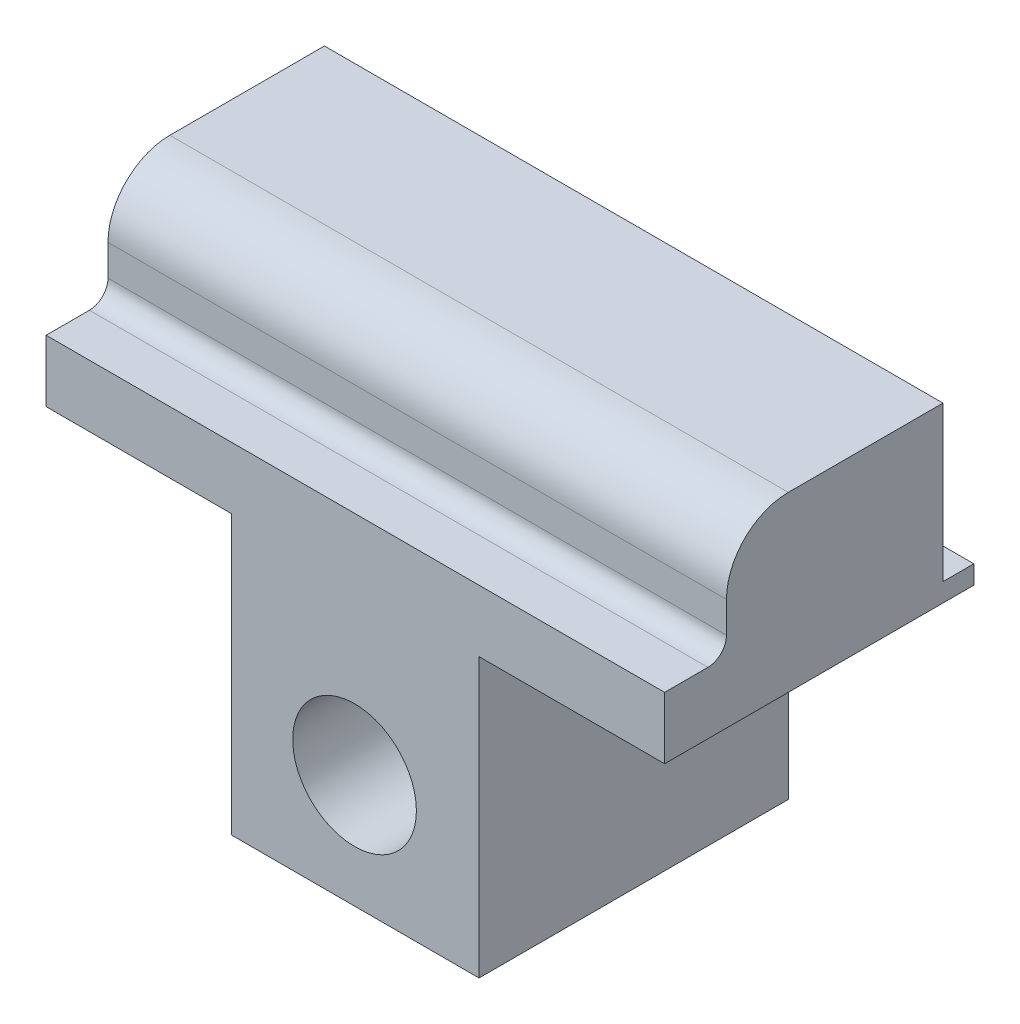
ISO-10303-21;
HEADER;
FILE_DESCRIPTION(('STEP AP214'),'2;1');
FILE_NAME('part.step','',(''),(''),'','','');
FILE_SCHEMA(('AUTOMOTIVE_DESIGN { 1 0 10303 214 1 1 1 1 }'));
ENDSEC;
DATA;
#1=APPLICATION_CONTEXT('core data for automotive mechanical design processes');
#2=APPLICATION_PROTOCOL_DEFINITION('international standard','automotive_design',2000,#1);
#3=PRODUCT_CONTEXT('',#1,'mechanical');
#4=PRODUCT('Part','Part','',(#3));
#5=PRODUCT_RELATED_PRODUCT_CATEGORY('part','',(#4));
#6=PRODUCT_DEFINITION_FORMATION('','',#4);
#7=PRODUCT_DEFINITION_CONTEXT('part definition',#1,'design');
#8=PRODUCT_DEFINITION('design','',#6,#7);
#9=PRODUCT_DEFINITION_SHAPE('','',#8);
#10=(LENGTH_UNIT() NAMED_UNIT(*) SI_UNIT(.MILLI.,.METRE.));
#11=(NAMED_UNIT(*) PLANE_ANGLE_UNIT() SI_UNIT($,.RADIAN.));
#12=(NAMED_UNIT(*) SI_UNIT($,.STERADIAN.) SOLID_ANGLE_UNIT());
#13=UNCERTAINTY_MEASURE_WITH_UNIT(LENGTH_MEASURE(1.E-05),#10,'distance_accuracy_value','');
#14=(GEOMETRIC_REPRESENTATION_CONTEXT(3) GLOBAL_UNCERTAINTY_ASSIGNED_CONTEXT((#13)) GLOBAL_UNIT_ASSIGNED_CONTEXT((#10,
#11,#12)) REPRESENTATION_CONTEXT('',''));
#15=CARTESIAN_POINT('',(0.,0.,0.));
#16=DIRECTION('',(0.,0.,1.));
#17=DIRECTION('',(1.,0.,0.));
#18=AXIS2_PLACEMENT_3D('',#15,#16,#17);
#19=CARTESIAN_POINT('',(100.,0.,25.));
#20=DIRECTION('',(0.,1.,0.));
#21=DIRECTION('',(0.,0.,1.));
#22=AXIS2_PLACEMENT_3D('',#19,#20,#21);
#23=PLANE('',#22);
#24=DIRECTION('',(0.,0.,1.));
#25=VECTOR('',#24,1.);
#26=CARTESIAN_POINT('',(70.,0.,-25.));
#27=LINE('',#26,#25);
#28=CARTESIAN_POINT('',(70.,0.,-25.));
#29=VERTEX_POINT('',#28);
#30=CARTESIAN_POINT('',(70.,0.,25.));
#31=VERTEX_POINT('',#30);
#32=EDGE_CURVE('E298',#29,#31,#27,.T.);
#33=ORIENTED_EDGE('',*,*,#32,.F.);
#34=DIRECTION('',(-1.,0.,0.));
#35=VECTOR('',#34,1.);
#36=CARTESIAN_POINT('',(100.,0.,-25.));
#37=LINE('',#36,#35);
#38=CARTESIAN_POINT('',(100.,0.,-25.));
#39=VERTEX_POINT('',#38);
#40=EDGE_CURVE('E233',#39,#29,#37,.T.);
#41=ORIENTED_EDGE('',*,*,#40,.F.);
#42=DIRECTION('',(0.,0.,-1.));
#43=VECTOR('',#42,1.);
#44=CARTESIAN_POINT('',(100.,0.,25.));
#45=LINE('',#44,#43);
#46=CARTESIAN_POINT('',(100.,0.,25.));
#47=VERTEX_POINT('',#46);
#48=EDGE_CURVE('E124',#47,#39,#45,.T.);
#49=ORIENTED_EDGE('',*,*,#48,.F.);
#50=DIRECTION('',(-1.,0.,0.));
#51=VECTOR('',#50,1.);
#52=CARTESIAN_POINT('',(100.,0.,25.));
#53=LINE('',#52,#51);
#54=EDGE_CURVE('E13',#47,#31,#53,.T.);
#55=ORIENTED_EDGE('',*,*,#54,.T.);
#56=EDGE_LOOP('',(#33,#41,#49,#55));
#57=FACE_BOUND('',#56,.T.);
#58=ADVANCED_FACE('F52',(#57),#23,.F.);
#59=CARTESIAN_POINT('',(100.,9.99999999999999,25.));
#60=DIRECTION('',(0.,0.,-1.));
#61=DIRECTION('',(-1.,0.,0.));
#62=AXIS2_PLACEMENT_3D('',#59,#60,#61);
#63=PLANE('',#62);
#64=CARTESIAN_POINT('',(49.8645413674315,-26.6514567641734,25.));
#65=DIRECTION('',(0.,0.,1.));
#66=DIRECTION('',(1.,0.,0.));
#67=AXIS2_PLACEMENT_3D('',#64,#65,#66);
#68=CIRCLE('',#67,10.);
#69=CARTESIAN_POINT('',(59.8645413674315,-26.6514567641734,25.));
#70=VERTEX_POINT('',#69);
#71=EDGE_CURVE('E328',#70,#70,#68,.T.);
#72=ORIENTED_EDGE('',*,*,#71,.F.);
#73=EDGE_LOOP('',(#72));
#74=FACE_BOUND('',#73,.T.);
#75=DIRECTION('',(0.,-1.,0.));
#76=VECTOR('',#75,1.);
#77=CARTESIAN_POINT('',(0.,10.,25.));
#78=LINE('',#77,#76);
#79=CARTESIAN_POINT('',(0.,10.,25.));
#80=VERTEX_POINT('',#79);
#81=CARTESIAN_POINT('',(0.,0.,25.));
#82=VERTEX_POINT('',#81);
#83=EDGE_CURVE('E179',#80,#82,#78,.T.);
#84=ORIENTED_EDGE('',*,*,#83,.T.);
#85=CARTESIAN_POINT('',(30.,0.,25.));
#86=VERTEX_POINT('',#85);
#87=EDGE_CURVE('E61',#86,#82,#53,.T.);
#88=ORIENTED_EDGE('',*,*,#87,.F.);
#89=DIRECTION('',(0.,-1.,0.));
#90=VECTOR('',#89,1.);
#91=CARTESIAN_POINT('',(30.,0.,25.));
#92=LINE('',#91,#90);
#93=CARTESIAN_POINT('',(30.,-45.0000000000001,25.));
#94=VERTEX_POINT('',#93);
#95=EDGE_CURVE('E68',#86,#94,#92,.T.);
#96=ORIENTED_EDGE('',*,*,#95,.T.);
#97=DIRECTION('',(1.,0.,0.));
#98=VECTOR('',#97,1.);
#99=CARTESIAN_POINT('',(30.,-45.0000000000001,25.));
#100=LINE('',#99,#98);
#101=CARTESIAN_POINT('',(70.,-45.,25.));
#102=VERTEX_POINT('',#101);
#103=EDGE_CURVE('E314',#94,#102,#100,.T.);
#104=ORIENTED_EDGE('',*,*,#103,.T.);
#105=DIRECTION('',(0.,1.,0.));
#106=VECTOR('',#105,1.);
#107=CARTESIAN_POINT('',(70.,-45.,25.));
#108=LINE('',#107,#106);
#109=EDGE_CURVE('E310',#102,#31,#108,.T.);
#110=ORIENTED_EDGE('',*,*,#109,.T.);
#111=ORIENTED_EDGE('',*,*,#54,.F.);
#112=DIRECTION('',(0.,-1.,0.));
#113=VECTOR('',#112,1.);
#114=CARTESIAN_POINT('',(100.,9.99999999999999,25.));
#115=LINE('',#114,#113);
#116=CARTESIAN_POINT('',(100.,9.99999999999999,25.));
#117=VERTEX_POINT('',#116);
#118=EDGE_CURVE('E210',#117,#47,#115,.T.);
#119=ORIENTED_EDGE('',*,*,#118,.F.);
#120=DIRECTION('',(-1.,0.,0.));
#121=VECTOR('',#120,1.);
#122=CARTESIAN_POINT('',(100.,9.99999999999999,25.));
#123=LINE('',#122,#121);
#124=EDGE_CURVE('E175',#117,#80,#123,.T.);
#125=ORIENTED_EDGE('',*,*,#124,.T.);
#126=EDGE_LOOP('',(#84,#88,#96,#104,#110,#111,#119,#125));
#127=FACE_BOUND('',#126,.T.);
#128=ADVANCED_FACE('F54',(#74,#127),#63,.F.);
#129=CARTESIAN_POINT('',(30.,0.,-25.));
#130=VERTEX_POINT('',#129);
#131=CARTESIAN_POINT('',(0.,0.,-25.));
#132=VERTEX_POINT('',#131);
#133=EDGE_CURVE('E232',#130,#132,#37,.T.);
#134=ORIENTED_EDGE('',*,*,#133,.F.);
#135=DIRECTION('',(0.,0.,1.));
#136=VECTOR('',#135,1.);
#137=CARTESIAN_POINT('',(30.,0.,-25.));
#138=LINE('',#137,#136);
#139=EDGE_CURVE('E302',#130,#86,#138,.T.);
#140=ORIENTED_EDGE('',*,*,#139,.T.);
#141=ORIENTED_EDGE('',*,*,#87,.T.);
#142=DIRECTION('',(0.,0.,-1.));
#143=VECTOR('',#142,1.);
#144=CARTESIAN_POINT('',(0.,0.,25.));
#145=LINE('',#144,#143);
#146=EDGE_CURVE('E183',#82,#132,#145,.T.);
#147=ORIENTED_EDGE('',*,*,#146,.T.);
#148=EDGE_LOOP('',(#134,#140,#141,#147));
#149=FACE_BOUND('',#148,.T.);
#150=ADVANCED_FACE('F255',(#149),#23,.F.);
#151=CARTESIAN_POINT('',(100.,0.,-25.));
#152=DIRECTION('',(0.,0.,1.));
#153=DIRECTION('',(1.,0.,0.));
#154=AXIS2_PLACEMENT_3D('',#151,#152,#153);
#155=PLANE('',#154);
#156=CARTESIAN_POINT('',(49.8645413674315,-26.6514567641734,-25.));
#157=DIRECTION('',(0.,0.,1.));
#158=DIRECTION('',(1.,0.,0.));
#159=AXIS2_PLACEMENT_3D('',#156,#157,#158);
#160=CIRCLE('',#159,10.);
#161=CARTESIAN_POINT('',(59.8645413674315,-26.6514567641734,-25.));
#162=VERTEX_POINT('',#161);
#163=EDGE_CURVE('E318',#162,#162,#160,.T.);
#164=ORIENTED_EDGE('',*,*,#163,.T.);
#165=EDGE_LOOP('',(#164));
#166=FACE_BOUND('',#165,.T.);
#167=DIRECTION('',(0.,1.,0.));
#168=VECTOR('',#167,1.);
#169=CARTESIAN_POINT('',(0.,0.,-25.));
#170=LINE('',#169,#168);
#171=CARTESIAN_POINT('',(0.,3.,-25.));
#172=VERTEX_POINT('',#171);
#173=EDGE_CURVE('E188',#132,#172,#170,.T.);
#174=ORIENTED_EDGE('',*,*,#173,.T.);
#175=DIRECTION('',(-1.,0.,0.));
#176=VECTOR('',#175,1.);
#177=CARTESIAN_POINT('',(100.,3.,-25.));
#178=LINE('',#177,#176);
#179=CARTESIAN_POINT('',(100.,3.,-25.));
#180=VERTEX_POINT('',#179);
#181=EDGE_CURVE('E229',#180,#172,#178,.T.);
#182=ORIENTED_EDGE('',*,*,#181,.F.);
#183=DIRECTION('',(0.,1.,0.));
#184=VECTOR('',#183,1.);
#185=CARTESIAN_POINT('',(100.,0.,-25.));
#186=LINE('',#185,#184);
#187=EDGE_CURVE('E281',#39,#180,#186,.T.);
#188=ORIENTED_EDGE('',*,*,#187,.F.);
#189=ORIENTED_EDGE('',*,*,#40,.T.);
#190=DIRECTION('',(0.,1.,0.));
#191=VECTOR('',#190,1.);
#192=CARTESIAN_POINT('',(70.,-45.,-25.));
#193=LINE('',#192,#191);
#194=CARTESIAN_POINT('',(70.,-45.,-25.));
#195=VERTEX_POINT('',#194);
#196=EDGE_CURVE('E321',#195,#29,#193,.T.);
#197=ORIENTED_EDGE('',*,*,#196,.F.);
#198=DIRECTION('',(1.,0.,0.));
#199=VECTOR('',#198,1.);
#200=CARTESIAN_POINT('',(30.,-45.0000000000001,-25.));
#201=LINE('',#200,#199);
#202=CARTESIAN_POINT('',(30.,-45.0000000000001,-25.));
#203=VERTEX_POINT('',#202);
#204=EDGE_CURVE('E309',#203,#195,#201,.T.);
#205=ORIENTED_EDGE('',*,*,#204,.F.);
#206=DIRECTION('',(0.,-1.,0.));
#207=VECTOR('',#206,1.);
#208=CARTESIAN_POINT('',(30.,0.,-25.));
#209=LINE('',#208,#207);
#210=EDGE_CURVE('E252',#130,#203,#209,.T.);
#211=ORIENTED_EDGE('',*,*,#210,.F.);
#212=ORIENTED_EDGE('',*,*,#133,.T.);
#213=EDGE_LOOP('',(#174,#182,#188,#189,#197,#205,#211,#212));
#214=FACE_BOUND('',#213,.T.);
#215=ADVANCED_FACE('F246',(#166,#214),#155,.F.);
#216=CARTESIAN_POINT('',(100.,3.,-25.));
#217=DIRECTION('',(0.,-1.,0.));
#218=DIRECTION('',(0.,0.,-1.));
#219=AXIS2_PLACEMENT_3D('',#216,#217,#218);
#220=PLANE('',#219);
#221=DIRECTION('',(0.,0.,1.));
#222=VECTOR('',#221,1.);
#223=CARTESIAN_POINT('',(0.,3.,-25.));
#224=LINE('',#223,#222);
#225=CARTESIAN_POINT('',(0.,3.,-20.));
#226=VERTEX_POINT('',#225);
#227=EDGE_CURVE('E191',#172,#226,#224,.T.);
#228=ORIENTED_EDGE('',*,*,#227,.T.);
#229=DIRECTION('',(-1.,0.,0.));
#230=VECTOR('',#229,1.);
#231=CARTESIAN_POINT('',(100.,3.,-20.));
#232=LINE('',#231,#230);
#233=CARTESIAN_POINT('',(100.,3.,-20.));
#234=VERTEX_POINT('',#233);
#235=EDGE_CURVE('E225',#234,#226,#232,.T.);
#236=ORIENTED_EDGE('',*,*,#235,.F.);
#237=DIRECTION('',(0.,0.,1.));
#238=VECTOR('',#237,1.);
#239=CARTESIAN_POINT('',(100.,3.,-25.));
#240=LINE('',#239,#238);
#241=EDGE_CURVE('E275',#180,#234,#240,.T.);
#242=ORIENTED_EDGE('',*,*,#241,.F.);
#243=ORIENTED_EDGE('',*,*,#181,.T.);
#244=EDGE_LOOP('',(#228,#236,#242,#243));
#245=FACE_BOUND('',#244,.T.);
#246=ADVANCED_FACE('F265',(#245),#220,.F.);
#247=CARTESIAN_POINT('',(100.,3.,-20.));
#248=DIRECTION('',(0.,0.,1.));
#249=DIRECTION('',(1.,0.,0.));
#250=AXIS2_PLACEMENT_3D('',#247,#248,#249);
#251=PLANE('',#250);
#252=CARTESIAN_POINT('',(20.,18.5,-20.));
#253=DIRECTION('',(0.,0.,1.));
#254=DIRECTION('',(1.,0.,0.));
#255=AXIS2_PLACEMENT_3D('',#252,#253,#254);
#256=CIRCLE('',#255,2.49999999999999);
#257=CARTESIAN_POINT('',(17.5,18.5,-20.));
#258=VERTEX_POINT('',#257);
#259=EDGE_CURVE('E360',#258,#258,#256,.T.);
#260=ORIENTED_EDGE('',*,*,#259,.T.);
#261=EDGE_LOOP('',(#260));
#262=FACE_BOUND('',#261,.T.);
#263=CARTESIAN_POINT('',(80.,18.5,-20.));
#264=DIRECTION('',(0.,0.,-1.));
#265=DIRECTION('',(-1.,0.,0.));
#266=AXIS2_PLACEMENT_3D('',#263,#264,#265);
#267=CIRCLE('',#266,2.49999999999999);
#268=CARTESIAN_POINT('',(77.5,18.5,-20.));
#269=VERTEX_POINT('',#268);
#270=EDGE_CURVE('E352',#269,#269,#267,.T.);
#271=ORIENTED_EDGE('',*,*,#270,.F.);
#272=EDGE_LOOP('',(#271));
#273=FACE_BOUND('',#272,.T.);
#274=DIRECTION('',(0.,1.,0.));
#275=VECTOR('',#274,1.);
#276=CARTESIAN_POINT('',(0.,3.,-20.));
#277=LINE('',#276,#275);
#278=CARTESIAN_POINT('',(0.,28.,-20.));
#279=VERTEX_POINT('',#278);
#280=EDGE_CURVE('E194',#226,#279,#277,.T.);
#281=ORIENTED_EDGE('',*,*,#280,.T.);
#282=DIRECTION('',(-1.,0.,0.));
#283=VECTOR('',#282,1.);
#284=CARTESIAN_POINT('',(100.,28.,-20.));
#285=LINE('',#284,#283);
#286=CARTESIAN_POINT('',(100.,28.,-20.));
#287=VERTEX_POINT('',#286);
#288=EDGE_CURVE('E221',#287,#279,#285,.T.);
#289=ORIENTED_EDGE('',*,*,#288,.F.);
#290=DIRECTION('',(0.,1.,0.));
#291=VECTOR('',#290,1.);
#292=CARTESIAN_POINT('',(100.,3.,-20.));
#293=LINE('',#292,#291);
#294=EDGE_CURVE('E271',#234,#287,#293,.T.);
#295=ORIENTED_EDGE('',*,*,#294,.F.);
#296=ORIENTED_EDGE('',*,*,#235,.T.);
#297=EDGE_LOOP('',(#281,#289,#295,#296));
#298=FACE_BOUND('',#297,.T.);
#299=ADVANCED_FACE('F269',(#262,#273,#298),#251,.F.);
#300=CARTESIAN_POINT('',(100.,28.,-20.));
#301=DIRECTION('',(0.,-1.,0.));
#302=DIRECTION('',(0.,0.,-1.));
#303=AXIS2_PLACEMENT_3D('',#300,#301,#302);
#304=PLANE('',#303);
#305=DIRECTION('',(0.,0.,1.));
#306=VECTOR('',#305,1.);
#307=CARTESIAN_POINT('',(0.,28.,-20.));
#308=LINE('',#307,#306);
#309=CARTESIAN_POINT('',(0.,28.,4.99999999999993));
#310=VERTEX_POINT('',#309);
#311=EDGE_CURVE('E197',#279,#310,#308,.T.);
#312=ORIENTED_EDGE('',*,*,#311,.T.);
#313=DIRECTION('',(-1.,0.,0.));
#314=VECTOR('',#313,1.);
#315=CARTESIAN_POINT('',(100.,28.,4.99999999999993));
#316=LINE('',#315,#314);
#317=CARTESIAN_POINT('',(100.,28.,4.99999999999993));
#318=VERTEX_POINT('',#317);
#319=EDGE_CURVE('E217',#318,#310,#316,.T.);
#320=ORIENTED_EDGE('',*,*,#319,.F.);
#321=DIRECTION('',(0.,0.,1.));
#322=VECTOR('',#321,1.);
#323=CARTESIAN_POINT('',(100.,28.,-20.));
#324=LINE('',#323,#322);
#325=EDGE_CURVE('E274',#287,#318,#324,.T.);
#326=ORIENTED_EDGE('',*,*,#325,.F.);
#327=ORIENTED_EDGE('',*,*,#288,.T.);
#328=EDGE_LOOP('',(#312,#320,#326,#327));
#329=FACE_BOUND('',#328,.T.);
#330=ADVANCED_FACE('F399',(#329),#304,.F.);
#331=CARTESIAN_POINT('',(100.,18.,5.));
#332=DIRECTION('',(-1.,0.,0.));
#333=DIRECTION('',(0.,0.,1.));
#334=AXIS2_PLACEMENT_3D('',#331,#332,#333);
#335=CYLINDRICAL_SURFACE('',#334,10.);
#336=CARTESIAN_POINT('',(0.,18.,5.));
#337=DIRECTION('',(1.,0.,0.));
#338=DIRECTION('',(0.,0.,-1.));
#339=AXIS2_PLACEMENT_3D('',#336,#337,#338);
#340=CIRCLE('',#339,10.);
#341=CARTESIAN_POINT('',(0.,17.9999999999999,15.));
#342=VERTEX_POINT('',#341);
#343=EDGE_CURVE('E200',#310,#342,#340,.T.);
#344=ORIENTED_EDGE('',*,*,#343,.T.);
#345=DIRECTION('',(-1.,0.,0.));
#346=VECTOR('',#345,1.);
#347=CARTESIAN_POINT('',(100.,17.9999999999999,15.));
#348=LINE('',#347,#346);
#349=CARTESIAN_POINT('',(100.,17.9999999999999,15.));
#350=VERTEX_POINT('',#349);
#351=EDGE_CURVE('E167',#350,#342,#348,.T.);
#352=ORIENTED_EDGE('',*,*,#351,.F.);
#353=CARTESIAN_POINT('',(100.,18.,5.));
#354=DIRECTION('',(1.,0.,0.));
#355=DIRECTION('',(0.,0.,-1.));
#356=AXIS2_PLACEMENT_3D('',#353,#354,#355);
#357=CIRCLE('',#356,10.);
#358=EDGE_CURVE('E153',#318,#350,#357,.T.);
#359=ORIENTED_EDGE('',*,*,#358,.F.);
#360=ORIENTED_EDGE('',*,*,#319,.T.);
#361=EDGE_LOOP('',(#344,#352,#359,#360));
#362=FACE_BOUND('',#361,.T.);
#363=ADVANCED_FACE('F403',(#362),#335,.T.);
#364=CARTESIAN_POINT('',(100.,17.9999999999999,15.));
#365=DIRECTION('',(0.,0.,-1.));
#366=DIRECTION('',(0.,1.,0.));
#367=AXIS2_PLACEMENT_3D('',#364,#365,#366);
#368=PLANE('',#367);
#369=DIRECTION('',(0.,-1.,0.));
#370=VECTOR('',#369,1.);
#371=CARTESIAN_POINT('',(0.,17.9999999999999,15.));
#372=LINE('',#371,#370);
#373=CARTESIAN_POINT('',(0.,13.,15.));
#374=VERTEX_POINT('',#373);
#375=EDGE_CURVE('E163',#342,#374,#372,.T.);
#376=ORIENTED_EDGE('',*,*,#375,.T.);
#377=DIRECTION('',(-1.,0.,0.));
#378=VECTOR('',#377,1.);
#379=CARTESIAN_POINT('',(100.,13.,15.));
#380=LINE('',#379,#378);
#381=CARTESIAN_POINT('',(100.,13.,15.));
#382=VERTEX_POINT('',#381);
#383=EDGE_CURVE('E160',#382,#374,#380,.T.);
#384=ORIENTED_EDGE('',*,*,#383,.F.);
#385=DIRECTION('',(0.,-1.,0.));
#386=VECTOR('',#385,1.);
#387=CARTESIAN_POINT('',(100.,17.9999999999999,15.));
#388=LINE('',#387,#386);
#389=EDGE_CURVE('E146',#350,#382,#388,.T.);
#390=ORIENTED_EDGE('',*,*,#389,.F.);
#391=ORIENTED_EDGE('',*,*,#351,.T.);
#392=EDGE_LOOP('',(#376,#384,#390,#391));
#393=FACE_BOUND('',#392,.T.);
#394=ADVANCED_FACE('F161',(#393),#368,.F.);
#395=CARTESIAN_POINT('',(100.,13.,18.));
#396=DIRECTION('',(-1.,0.,0.));
#397=DIRECTION('',(0.,0.,1.));
#398=AXIS2_PLACEMENT_3D('',#395,#396,#397);
#399=CYLINDRICAL_SURFACE('',#398,3.);
#400=CARTESIAN_POINT('',(0.,13.,18.));
#401=DIRECTION('',(-1.,0.,0.));
#402=DIRECTION('',(0.,0.,1.));
#403=AXIS2_PLACEMENT_3D('',#400,#401,#402);
#404=CIRCLE('',#403,3.);
#405=CARTESIAN_POINT('',(0.,10.,18.));
#406=VERTEX_POINT('',#405);
#407=EDGE_CURVE('E205',#374,#406,#404,.T.);
#408=ORIENTED_EDGE('',*,*,#407,.T.);
#409=DIRECTION('',(-1.,0.,0.));
#410=VECTOR('',#409,1.);
#411=CARTESIAN_POINT('',(100.,9.99999999999999,18.));
#412=LINE('',#411,#410);
#413=CARTESIAN_POINT('',(100.,9.99999999999999,18.));
#414=VERTEX_POINT('',#413);
#415=EDGE_CURVE('E168',#414,#406,#412,.T.);
#416=ORIENTED_EDGE('',*,*,#415,.F.);
#417=CARTESIAN_POINT('',(100.,13.,18.));
#418=DIRECTION('',(-1.,0.,0.));
#419=DIRECTION('',(0.,0.,1.));
#420=AXIS2_PLACEMENT_3D('',#417,#418,#419);
#421=CIRCLE('',#420,3.);
#422=EDGE_CURVE('E150',#382,#414,#421,.T.);
#423=ORIENTED_EDGE('',*,*,#422,.F.);
#424=ORIENTED_EDGE('',*,*,#383,.T.);
#425=EDGE_LOOP('',(#408,#416,#423,#424));
#426=FACE_BOUND('',#425,.T.);
#427=ADVANCED_FACE('F170',(#426),#399,.F.);
#428=CARTESIAN_POINT('',(100.,9.99999999999999,18.));
#429=DIRECTION('',(0.,-1.,0.));
#430=DIRECTION('',(0.,0.,-1.));
#431=AXIS2_PLACEMENT_3D('',#428,#429,#430);
#432=PLANE('',#431);
#433=DIRECTION('',(0.,0.,1.));
#434=VECTOR('',#433,1.);
#435=CARTESIAN_POINT('',(0.,10.,18.));
#436=LINE('',#435,#434);
#437=EDGE_CURVE('E116',#406,#80,#436,.T.);
#438=ORIENTED_EDGE('',*,*,#437,.T.);
#439=ORIENTED_EDGE('',*,*,#124,.F.);
#440=DIRECTION('',(0.,0.,1.));
#441=VECTOR('',#440,1.);
#442=CARTESIAN_POINT('',(100.,9.99999999999999,18.));
#443=LINE('',#442,#441);
#444=EDGE_CURVE('E77',#414,#117,#443,.T.);
#445=ORIENTED_EDGE('',*,*,#444,.F.);
#446=ORIENTED_EDGE('',*,*,#415,.T.);
#447=EDGE_LOOP('',(#438,#439,#445,#446));
#448=FACE_BOUND('',#447,.T.);
#449=ADVANCED_FACE('F412',(#448),#432,.F.);
#450=CARTESIAN_POINT('',(100.,18.,5.));
#451=DIRECTION('',(1.,0.,0.));
#452=DIRECTION('',(0.,0.,-1.));
#453=AXIS2_PLACEMENT_3D('',#450,#451,#452);
#454=PLANE('',#453);
#455=ORIENTED_EDGE('',*,*,#118,.T.);
#456=ORIENTED_EDGE('',*,*,#48,.T.);
#457=ORIENTED_EDGE('',*,*,#187,.T.);
#458=ORIENTED_EDGE('',*,*,#241,.T.);
#459=ORIENTED_EDGE('',*,*,#294,.T.);
#460=ORIENTED_EDGE('',*,*,#325,.T.);
#461=ORIENTED_EDGE('',*,*,#358,.T.);
#462=ORIENTED_EDGE('',*,*,#389,.T.);
#463=ORIENTED_EDGE('',*,*,#422,.T.);
#464=ORIENTED_EDGE('',*,*,#444,.T.);
#465=EDGE_LOOP('',(#455,#456,#457,#458,#459,#460,#461,#462,#463,#464));
#466=FACE_BOUND('',#465,.T.);
#467=ADVANCED_FACE('F148',(#466),#454,.T.);
#468=CARTESIAN_POINT('',(0.,18.,5.));
#469=DIRECTION('',(1.,0.,0.));
#470=DIRECTION('',(0.,0.,-1.));
#471=AXIS2_PLACEMENT_3D('',#468,#469,#470);
#472=PLANE('',#471);
#473=ORIENTED_EDGE('',*,*,#83,.F.);
#474=ORIENTED_EDGE('',*,*,#437,.F.);
#475=ORIENTED_EDGE('',*,*,#407,.F.);
#476=ORIENTED_EDGE('',*,*,#375,.F.);
#477=ORIENTED_EDGE('',*,*,#343,.F.);
#478=ORIENTED_EDGE('',*,*,#311,.F.);
#479=ORIENTED_EDGE('',*,*,#280,.F.);
#480=ORIENTED_EDGE('',*,*,#227,.F.);
#481=ORIENTED_EDGE('',*,*,#173,.F.);
#482=ORIENTED_EDGE('',*,*,#146,.F.);
#483=EDGE_LOOP('',(#473,#474,#475,#476,#477,#478,#479,#480,#481,#482));
#484=FACE_BOUND('',#483,.T.);
#485=ADVANCED_FACE('F260',(#484),#472,.F.);
#486=CARTESIAN_POINT('',(30.,-45.0000000000001,-25.));
#487=DIRECTION('',(0.,-1.,0.));
#488=DIRECTION('',(0.,0.,-1.));
#489=AXIS2_PLACEMENT_3D('',#486,#487,#488);
#490=PLANE('',#489);
#491=CARTESIAN_POINT('',(62.0052155071406,-45.,0.0100187966154391));
#492=DIRECTION('',(0.,1.,0.));
#493=DIRECTION('',(0.,0.,-1.));
#494=AXIS2_PLACEMENT_3D('',#491,#492,#493);
#495=CIRCLE('',#494,2.5);
#496=CARTESIAN_POINT('',(62.0052155071406,-45.,-2.48998120338456));
#497=VERTEX_POINT('',#496);
#498=EDGE_CURVE('E344',#497,#497,#495,.T.);
#499=ORIENTED_EDGE('',*,*,#498,.T.);
#500=EDGE_LOOP('',(#499));
#501=FACE_BOUND('',#500,.T.);
#502=CARTESIAN_POINT('',(37.9947844928594,-45.,0.0100187966154408));
#503=DIRECTION('',(0.,-1.,0.));
#504=DIRECTION('',(0.,0.,-1.));
#505=AXIS2_PLACEMENT_3D('',#502,#503,#504);
#506=CIRCLE('',#505,2.5);
#507=CARTESIAN_POINT('',(37.9947844928594,-45.,-2.48998120338456));
#508=VERTEX_POINT('',#507);
#509=EDGE_CURVE('E336',#508,#508,#506,.T.);
#510=ORIENTED_EDGE('',*,*,#509,.F.);
#511=EDGE_LOOP('',(#510));
#512=FACE_BOUND('',#511,.T.);
#513=ORIENTED_EDGE('',*,*,#103,.F.);
#514=DIRECTION('',(0.,0.,1.));
#515=VECTOR('',#514,1.);
#516=CARTESIAN_POINT('',(30.,-45.0000000000001,-25.));
#517=LINE('',#516,#515);
#518=EDGE_CURVE('E184',#203,#94,#517,.T.);
#519=ORIENTED_EDGE('',*,*,#518,.F.);
#520=ORIENTED_EDGE('',*,*,#204,.T.);
#521=DIRECTION('',(0.,0.,1.));
#522=VECTOR('',#521,1.);
#523=CARTESIAN_POINT('',(70.,-45.,-25.));
#524=LINE('',#523,#522);
#525=EDGE_CURVE('E294',#195,#102,#524,.T.);
#526=ORIENTED_EDGE('',*,*,#525,.T.);
#527=EDGE_LOOP('',(#513,#519,#520,#526));
#528=FACE_BOUND('',#527,.T.);
#529=ADVANCED_FACE('F417',(#501,#512,#528),#490,.T.);
#530=CARTESIAN_POINT('',(30.,0.,-25.));
#531=DIRECTION('',(-1.,0.,0.));
#532=DIRECTION('',(0.,-1.,0.));
#533=AXIS2_PLACEMENT_3D('',#530,#531,#532);
#534=PLANE('',#533);
#535=ORIENTED_EDGE('',*,*,#95,.F.);
#536=ORIENTED_EDGE('',*,*,#139,.F.);
#537=ORIENTED_EDGE('',*,*,#210,.T.);
#538=ORIENTED_EDGE('',*,*,#518,.T.);
#539=EDGE_LOOP('',(#535,#536,#537,#538));
#540=FACE_BOUND('',#539,.T.);
#541=ADVANCED_FACE('F422',(#540),#534,.T.);
#542=CARTESIAN_POINT('',(70.,-45.,-25.));
#543=DIRECTION('',(1.,0.,0.));
#544=DIRECTION('',(0.,0.,-1.));
#545=AXIS2_PLACEMENT_3D('',#542,#543,#544);
#546=PLANE('',#545);
#547=ORIENTED_EDGE('',*,*,#109,.F.);
#548=ORIENTED_EDGE('',*,*,#525,.F.);
#549=ORIENTED_EDGE('',*,*,#196,.T.);
#550=ORIENTED_EDGE('',*,*,#32,.T.);
#551=EDGE_LOOP('',(#547,#548,#549,#550));
#552=FACE_BOUND('',#551,.T.);
#553=ADVANCED_FACE('F424',(#552),#546,.T.);
#554=CARTESIAN_POINT('',(49.8645413674315,-26.6514567641734,-25.));
#555=DIRECTION('',(0.,0.,1.));
#556=DIRECTION('',(1.,0.,0.));
#557=AXIS2_PLACEMENT_3D('',#554,#555,#556);
#558=CYLINDRICAL_SURFACE('',#557,10.);
#559=ORIENTED_EDGE('',*,*,#163,.F.);
#560=EDGE_LOOP('',(#559));
#561=FACE_BOUND('',#560,.T.);
#562=ORIENTED_EDGE('',*,*,#71,.T.);
#563=EDGE_LOOP('',(#562));
#564=FACE_BOUND('',#563,.T.);
#565=ADVANCED_FACE('F427',(#561,#564),#558,.F.);
#566=CARTESIAN_POINT('',(37.9947844928594,-32.,0.0100187966154408));
#567=DIRECTION('',(0.,-1.,0.));
#568=DIRECTION('',(0.,0.,-1.));
#569=AXIS2_PLACEMENT_3D('',#566,#567,#568);
#570=CYLINDRICAL_SURFACE('',#569,2.5);
#571=CARTESIAN_POINT('',(37.9947844928594,-32.,0.0100187966154408));
#572=DIRECTION('',(0.,-1.,0.));
#573=DIRECTION('',(0.,0.,-1.));
#574=AXIS2_PLACEMENT_3D('',#571,#572,#573);
#575=CIRCLE('',#574,2.5);
#576=CARTESIAN_POINT('',(37.9947844928594,-32.,-2.48998120338456));
#577=VERTEX_POINT('',#576);
#578=EDGE_CURVE('E332',#577,#577,#575,.T.);
#579=CARTESIAN_POINT('',(37.9947844928594,-32.,-2.48998120338456));
#580=CARTESIAN_POINT('',(37.9947844928594,-32.1354166666667,-2.48998120338456));
#581=CARTESIAN_POINT('',(37.9947844928594,-32.2708333333334,-2.48998120338456));
#582=CARTESIAN_POINT('',(37.9947844928594,-32.5416666666667,-2.48998120338456));
#583=CARTESIAN_POINT('',(37.9947844928594,-32.6770833333334,-2.48998120338456));
#584=CARTESIAN_POINT('',(37.9947844928594,-32.9479166666667,-2.48998120338456));
#585=CARTESIAN_POINT('',(37.9947844928594,-33.0833333333334,-2.48998120338456));
#586=CARTESIAN_POINT('',(37.9947844928594,-33.3541666666667,-2.48998120338456));
#587=CARTESIAN_POINT('',(37.9947844928594,-33.4895833333334,-2.48998120338456));
#588=CARTESIAN_POINT('',(37.9947844928594,-33.7604166666667,-2.48998120338456));
#589=CARTESIAN_POINT('',(37.9947844928594,-33.8958333333334,-2.48998120338456));
#590=CARTESIAN_POINT('',(37.9947844928594,-34.1666666666667,-2.48998120338456));
#591=CARTESIAN_POINT('',(37.9947844928594,-34.3020833333334,-2.48998120338456));
#592=CARTESIAN_POINT('',(37.9947844928594,-34.5729166666667,-2.48998120338456));
#593=CARTESIAN_POINT('',(37.9947844928594,-34.7083333333334,-2.48998120338456));
#594=CARTESIAN_POINT('',(37.9947844928594,-34.9791666666667,-2.48998120338456));
#595=CARTESIAN_POINT('',(37.9947844928594,-35.1145833333334,-2.48998120338456));
#596=CARTESIAN_POINT('',(37.9947844928594,-35.3854166666667,-2.48998120338456));
#597=CARTESIAN_POINT('',(37.9947844928594,-35.5208333333334,-2.48998120338456));
#598=CARTESIAN_POINT('',(37.9947844928594,-35.7916666666667,-2.48998120338456));
#599=CARTESIAN_POINT('',(37.9947844928594,-35.9270833333334,-2.48998120338456));
#600=CARTESIAN_POINT('',(37.9947844928594,-36.1979166666667,-2.48998120338456));
#601=CARTESIAN_POINT('',(37.9947844928594,-36.3333333333334,-2.48998120338456));
#602=CARTESIAN_POINT('',(37.9947844928594,-36.6041666666667,-2.48998120338456));
#603=CARTESIAN_POINT('',(37.9947844928594,-36.7395833333334,-2.48998120338456));
#604=CARTESIAN_POINT('',(37.9947844928594,-37.0104166666667,-2.48998120338456));
#605=CARTESIAN_POINT('',(37.9947844928594,-37.1458333333334,-2.48998120338456));
#606=CARTESIAN_POINT('',(37.9947844928594,-37.4166666666667,-2.48998120338456));
#607=CARTESIAN_POINT('',(37.9947844928594,-37.5520833333334,-2.48998120338456));
#608=CARTESIAN_POINT('',(37.9947844928594,-37.8229166666667,-2.48998120338456));
#609=CARTESIAN_POINT('',(37.9947844928594,-37.9583333333334,-2.48998120338456));
#610=CARTESIAN_POINT('',(37.9947844928594,-38.2291666666667,-2.48998120338456));
#611=CARTESIAN_POINT('',(37.9947844928594,-38.3645833333334,-2.48998120338456));
#612=CARTESIAN_POINT('',(37.9947844928594,-38.6354166666667,-2.48998120338456));
#613=CARTESIAN_POINT('',(37.9947844928594,-38.7708333333334,-2.48998120338456));
#614=CARTESIAN_POINT('',(37.9947844928594,-39.0416666666667,-2.48998120338456));
#615=CARTESIAN_POINT('',(37.9947844928594,-39.1770833333334,-2.48998120338456));
#616=CARTESIAN_POINT('',(37.9947844928594,-39.4479166666667,-2.48998120338456));
#617=CARTESIAN_POINT('',(37.9947844928594,-39.5833333333334,-2.48998120338456));
#618=CARTESIAN_POINT('',(37.9947844928594,-39.8541666666667,-2.48998120338456));
#619=CARTESIAN_POINT('',(37.9947844928594,-39.9895833333334,-2.48998120338456));
#620=CARTESIAN_POINT('',(37.9947844928594,-40.2604166666667,-2.48998120338456));
#621=CARTESIAN_POINT('',(37.9947844928594,-40.3958333333334,-2.48998120338456));
#622=CARTESIAN_POINT('',(37.9947844928594,-40.6666666666667,-2.48998120338456));
#623=CARTESIAN_POINT('',(37.9947844928594,-40.8020833333334,-2.48998120338456));
#624=CARTESIAN_POINT('',(37.9947844928594,-41.0729166666667,-2.48998120338456));
#625=CARTESIAN_POINT('',(37.9947844928594,-41.2083333333334,-2.48998120338456));
#626=CARTESIAN_POINT('',(37.9947844928594,-41.4791666666667,-2.48998120338456));
#627=CARTESIAN_POINT('',(37.9947844928594,-41.6145833333334,-2.48998120338456));
#628=CARTESIAN_POINT('',(37.9947844928594,-41.8854166666667,-2.48998120338456));
#629=CARTESIAN_POINT('',(37.9947844928594,-42.0208333333334,-2.48998120338456));
#630=CARTESIAN_POINT('',(37.9947844928594,-42.2916666666667,-2.48998120338456));
#631=CARTESIAN_POINT('',(37.9947844928594,-42.4270833333334,-2.48998120338456));
#632=CARTESIAN_POINT('',(37.9947844928594,-42.6979166666667,-2.48998120338456));
#633=CARTESIAN_POINT('',(37.9947844928594,-42.8333333333334,-2.48998120338456));
#634=CARTESIAN_POINT('',(37.9947844928594,-43.1041666666667,-2.48998120338456));
#635=CARTESIAN_POINT('',(37.9947844928594,-43.2395833333334,-2.48998120338456));
#636=CARTESIAN_POINT('',(37.9947844928594,-43.5104166666667,-2.48998120338456));
#637=CARTESIAN_POINT('',(37.9947844928594,-43.6458333333334,-2.48998120338456));
#638=CARTESIAN_POINT('',(37.9947844928594,-43.9166666666667,-2.48998120338456));
#639=CARTESIAN_POINT('',(37.9947844928594,-44.0520833333334,-2.48998120338456));
#640=CARTESIAN_POINT('',(37.9947844928594,-44.3229166666667,-2.48998120338456));
#641=CARTESIAN_POINT('',(37.9947844928594,-44.4583333333334,-2.48998120338456));
#642=CARTESIAN_POINT('',(37.9947844928594,-44.7291666666667,-2.48998120338456));
#643=CARTESIAN_POINT('',(37.9947844928594,-44.8645833333334,-2.48998120338456));
#644=CARTESIAN_POINT('',(37.9947844928594,-45.,-2.48998120338456));
#645=B_SPLINE_CURVE_WITH_KNOTS('',3,(#579,#580,#581,#582,#583,#584,#585,#586,#587,#588,#589,
#590,#591,#592,#593,#594,#595,#596,#597,#598,#599,#600,#601,#602,#603,#604,#605,#606,#607,#608,
#609,#610,#611,#612,#613,#614,#615,#616,#617,#618,#619,#620,#621,#622,#623,#624,#625,#626,#627,
#628,#629,#630,#631,#632,#633,#634,#635,#636,#637,#638,#639,#640,#641,#642,#643,#644),
.UNSPECIFIED.,.F.,.F.,(4,2,2,2,2,2,2,2,2,2,2,2,2,2,2,2,2,2,2,2,2,2,2,2,2,2,2,2,2,2,2,2,4),(0.,
0.406249999999997,0.812499999999994,1.21875,1.62499999999999,2.03125,2.4375,2.84375,3.25,
3.65624999999999,4.0625,4.46874999999999,4.875,5.28124999999999,5.6875,6.09374999999999,6.5,
6.90625,7.31249999999999,7.71875,8.12499999999999,8.53125,8.93749999999999,9.34375,
9.74999999999999,10.15625,10.5625,10.96875,11.375,11.78125,12.1875,12.59375,13.),.UNSPECIFIED.);
#646=EDGE_CURVE('BSEAM433',#577,#508,#645,.T.);
#647=ORIENTED_EDGE('',*,*,#578,.F.);
#648=ORIENTED_EDGE('',*,*,#509,.T.);
#649=ORIENTED_EDGE('',*,*,#646,.T.);
#650=ORIENTED_EDGE('',*,*,#646,.F.);
#651=EDGE_LOOP('',(#647,#649,#648,#650));
#652=FACE_BOUND('',#651,.T.);
#653=ADVANCED_FACE('F433',(#652),#570,.F.);
#654=CARTESIAN_POINT('',(37.9947844928594,-32.,0.0100187966154408));
#655=DIRECTION('',(0.,-1.,0.));
#656=DIRECTION('',(0.,0.,-1.));
#657=AXIS2_PLACEMENT_3D('',#654,#655,#656);
#658=PLANE('',#657);
#659=ORIENTED_EDGE('',*,*,#578,.T.);
#660=EDGE_LOOP('',(#659));
#661=FACE_BOUND('',#660,.T.);
#662=ADVANCED_FACE('F437',(#661),#658,.T.);
#663=CARTESIAN_POINT('',(62.0052155071406,-32.,0.0100187966154408));
#664=DIRECTION('',(0.,-1.,0.));
#665=DIRECTION('',(0.,0.,-1.));
#666=AXIS2_PLACEMENT_3D('',#663,#664,#665);
#667=CYLINDRICAL_SURFACE('',#666,2.5);
#668=CARTESIAN_POINT('',(62.0052155071406,-32.,0.0100187966154408));
#669=DIRECTION('',(0.,1.,0.));
#670=DIRECTION('',(0.,0.,-1.));
#671=AXIS2_PLACEMENT_3D('',#668,#669,#670);
#672=CIRCLE('',#671,2.5);
#673=CARTESIAN_POINT('',(62.0052155071406,-32.,-2.48998120338456));
#674=VERTEX_POINT('',#673);
#675=EDGE_CURVE('E340',#674,#674,#672,.T.);
#676=CARTESIAN_POINT('',(62.0052155071406,-32.,-2.48998120338456));
#677=CARTESIAN_POINT('',(62.0052155071406,-32.1354166666667,-2.48998120338456));
#678=CARTESIAN_POINT('',(62.0052155071406,-32.2708333333334,-2.48998120338456));
#679=CARTESIAN_POINT('',(62.0052155071406,-32.5416666666667,-2.48998120338456));
#680=CARTESIAN_POINT('',(62.0052155071406,-32.6770833333334,-2.48998120338456));
#681=CARTESIAN_POINT('',(62.0052155071406,-32.9479166666667,-2.48998120338456));
#682=CARTESIAN_POINT('',(62.0052155071406,-33.0833333333334,-2.48998120338456));
#683=CARTESIAN_POINT('',(62.0052155071406,-33.3541666666667,-2.48998120338456));
#684=CARTESIAN_POINT('',(62.0052155071406,-33.4895833333334,-2.48998120338456));
#685=CARTESIAN_POINT('',(62.0052155071406,-33.7604166666667,-2.48998120338456));
#686=CARTESIAN_POINT('',(62.0052155071406,-33.8958333333334,-2.48998120338456));
#687=CARTESIAN_POINT('',(62.0052155071406,-34.1666666666667,-2.48998120338456));
#688=CARTESIAN_POINT('',(62.0052155071406,-34.3020833333334,-2.48998120338456));
#689=CARTESIAN_POINT('',(62.0052155071406,-34.5729166666667,-2.48998120338456));
#690=CARTESIAN_POINT('',(62.0052155071406,-34.7083333333334,-2.48998120338456));
#691=CARTESIAN_POINT('',(62.0052155071406,-34.9791666666667,-2.48998120338456));
#692=CARTESIAN_POINT('',(62.0052155071406,-35.1145833333334,-2.48998120338456));
#693=CARTESIAN_POINT('',(62.0052155071406,-35.3854166666667,-2.48998120338456));
#694=CARTESIAN_POINT('',(62.0052155071406,-35.5208333333334,-2.48998120338456));
#695=CARTESIAN_POINT('',(62.0052155071406,-35.7916666666667,-2.48998120338456));
#696=CARTESIAN_POINT('',(62.0052155071406,-35.9270833333334,-2.48998120338456));
#697=CARTESIAN_POINT('',(62.0052155071406,-36.1979166666667,-2.48998120338456));
#698=CARTESIAN_POINT('',(62.0052155071406,-36.3333333333334,-2.48998120338456));
#699=CARTESIAN_POINT('',(62.0052155071406,-36.6041666666667,-2.48998120338456));
#700=CARTESIAN_POINT('',(62.0052155071406,-36.7395833333334,-2.48998120338456));
#701=CARTESIAN_POINT('',(62.0052155071406,-37.0104166666667,-2.48998120338456));
#702=CARTESIAN_POINT('',(62.0052155071406,-37.1458333333334,-2.48998120338456));
#703=CARTESIAN_POINT('',(62.0052155071406,-37.4166666666667,-2.48998120338456));
#704=CARTESIAN_POINT('',(62.0052155071406,-37.5520833333334,-2.48998120338456));
#705=CARTESIAN_POINT('',(62.0052155071406,-37.8229166666667,-2.48998120338456));
#706=CARTESIAN_POINT('',(62.0052155071406,-37.9583333333334,-2.48998120338456));
#707=CARTESIAN_POINT('',(62.0052155071406,-38.2291666666667,-2.48998120338456));
#708=CARTESIAN_POINT('',(62.0052155071406,-38.3645833333334,-2.48998120338456));
#709=CARTESIAN_POINT('',(62.0052155071406,-38.6354166666667,-2.48998120338456));
#710=CARTESIAN_POINT('',(62.0052155071406,-38.7708333333334,-2.48998120338456));
#711=CARTESIAN_POINT('',(62.0052155071406,-39.0416666666667,-2.48998120338456));
#712=CARTESIAN_POINT('',(62.0052155071406,-39.1770833333334,-2.48998120338456));
#713=CARTESIAN_POINT('',(62.0052155071406,-39.4479166666667,-2.48998120338456));
#714=CARTESIAN_POINT('',(62.0052155071406,-39.5833333333334,-2.48998120338456));
#715=CARTESIAN_POINT('',(62.0052155071406,-39.8541666666667,-2.48998120338456));
#716=CARTESIAN_POINT('',(62.0052155071406,-39.9895833333334,-2.48998120338456));
#717=CARTESIAN_POINT('',(62.0052155071406,-40.2604166666667,-2.48998120338456));
#718=CARTESIAN_POINT('',(62.0052155071406,-40.3958333333334,-2.48998120338456));
#719=CARTESIAN_POINT('',(62.0052155071406,-40.6666666666667,-2.48998120338456));
#720=CARTESIAN_POINT('',(62.0052155071406,-40.8020833333334,-2.48998120338456));
#721=CARTESIAN_POINT('',(62.0052155071406,-41.0729166666667,-2.48998120338456));
#722=CARTESIAN_POINT('',(62.0052155071406,-41.2083333333334,-2.48998120338456));
#723=CARTESIAN_POINT('',(62.0052155071406,-41.4791666666667,-2.48998120338456));
#724=CARTESIAN_POINT('',(62.0052155071406,-41.6145833333334,-2.48998120338456));
#725=CARTESIAN_POINT('',(62.0052155071406,-41.8854166666667,-2.48998120338456));
#726=CARTESIAN_POINT('',(62.0052155071406,-42.0208333333334,-2.48998120338456));
#727=CARTESIAN_POINT('',(62.0052155071406,-42.2916666666667,-2.48998120338456));
#728=CARTESIAN_POINT('',(62.0052155071406,-42.4270833333334,-2.48998120338456));
#729=CARTESIAN_POINT('',(62.0052155071406,-42.6979166666667,-2.48998120338456));
#730=CARTESIAN_POINT('',(62.0052155071406,-42.8333333333334,-2.48998120338456));
#731=CARTESIAN_POINT('',(62.0052155071406,-43.1041666666667,-2.48998120338456));
#732=CARTESIAN_POINT('',(62.0052155071406,-43.2395833333334,-2.48998120338456));
#733=CARTESIAN_POINT('',(62.0052155071406,-43.5104166666667,-2.48998120338456));
#734=CARTESIAN_POINT('',(62.0052155071406,-43.6458333333334,-2.48998120338456));
#735=CARTESIAN_POINT('',(62.0052155071406,-43.9166666666667,-2.48998120338456));
#736=CARTESIAN_POINT('',(62.0052155071406,-44.0520833333334,-2.48998120338456));
#737=CARTESIAN_POINT('',(62.0052155071406,-44.3229166666667,-2.48998120338456));
#738=CARTESIAN_POINT('',(62.0052155071406,-44.4583333333334,-2.48998120338456));
#739=CARTESIAN_POINT('',(62.0052155071406,-44.7291666666667,-2.48998120338456));
#740=CARTESIAN_POINT('',(62.0052155071406,-44.8645833333334,-2.48998120338456));
#741=CARTESIAN_POINT('',(62.0052155071406,-45.,-2.48998120338456));
#742=B_SPLINE_CURVE_WITH_KNOTS('',3,(#676,#677,#678,#679,#680,#681,#682,#683,#684,#685,#686,
#687,#688,#689,#690,#691,#692,#693,#694,#695,#696,#697,#698,#699,#700,#701,#702,#703,#704,#705,
#706,#707,#708,#709,#710,#711,#712,#713,#714,#715,#716,#717,#718,#719,#720,#721,#722,#723,#724,
#725,#726,#727,#728,#729,#730,#731,#732,#733,#734,#735,#736,#737,#738,#739,#740,#741),
.UNSPECIFIED.,.F.,.F.,(4,2,2,2,2,2,2,2,2,2,2,2,2,2,2,2,2,2,2,2,2,2,2,2,2,2,2,2,2,2,2,2,4),(0.,
0.406249999999997,0.812499999999994,1.21875,1.62499999999999,2.03125,2.4375,2.84375,3.25,
3.65624999999999,4.0625,4.46874999999999,4.875,5.28124999999999,5.6875,6.09374999999999,6.5,
6.90625,7.31249999999999,7.71875,8.12499999999999,8.53125,8.93749999999999,9.34375,
9.74999999999999,10.15625,10.5625,10.96875,11.375,11.78125,12.1875,12.59375,13.),.UNSPECIFIED.);
#743=EDGE_CURVE('BSEAM441',#674,#497,#742,.T.);
#744=ORIENTED_EDGE('',*,*,#675,.T.);
#745=ORIENTED_EDGE('',*,*,#498,.F.);
#746=ORIENTED_EDGE('',*,*,#743,.T.);
#747=ORIENTED_EDGE('',*,*,#743,.F.);
#748=EDGE_LOOP('',(#744,#746,#745,#747));
#749=FACE_BOUND('',#748,.T.);
#750=ADVANCED_FACE('F441',(#749),#667,.F.);
#751=CARTESIAN_POINT('',(62.0052155071406,-32.,0.0100187966154408));
#752=DIRECTION('',(0.,-1.,0.));
#753=DIRECTION('',(0.,0.,-1.));
#754=AXIS2_PLACEMENT_3D('',#751,#752,#753);
#755=PLANE('',#754);
#756=ORIENTED_EDGE('',*,*,#675,.F.);
#757=EDGE_LOOP('',(#756));
#758=FACE_BOUND('',#757,.T.);
#759=ADVANCED_FACE('F445',(#758),#755,.T.);
#760=CARTESIAN_POINT('',(80.,18.5,-7.));
#761=DIRECTION('',(0.,0.,-1.));
#762=DIRECTION('',(-1.,0.,0.));
#763=AXIS2_PLACEMENT_3D('',#760,#761,#762);
#764=CYLINDRICAL_SURFACE('',#763,2.49999999999999);
#765=CARTESIAN_POINT('',(80.,18.5,-7.));
#766=DIRECTION('',(0.,0.,-1.));
#767=DIRECTION('',(-1.,0.,0.));
#768=AXIS2_PLACEMENT_3D('',#765,#766,#767);
#769=CIRCLE('',#768,2.49999999999999);
#770=CARTESIAN_POINT('',(77.5,18.5,-7.));
#771=VERTEX_POINT('',#770);
#772=EDGE_CURVE('E348',#771,#771,#769,.T.);
#773=CARTESIAN_POINT('',(77.5,18.5,-7.));
#774=CARTESIAN_POINT('',(77.5,18.5,-7.13541666666667));
#775=CARTESIAN_POINT('',(77.5,18.5,-7.27083333333333));
#776=CARTESIAN_POINT('',(77.5,18.5,-7.54166666666667));
#777=CARTESIAN_POINT('',(77.5,18.5,-7.67708333333333));
#778=CARTESIAN_POINT('',(77.5,18.5,-7.94791666666667));
#779=CARTESIAN_POINT('',(77.5,18.5,-8.08333333333333));
#780=CARTESIAN_POINT('',(77.5,18.5,-8.35416666666667));
#781=CARTESIAN_POINT('',(77.5,18.5,-8.48958333333333));
#782=CARTESIAN_POINT('',(77.5,18.5,-8.76041666666667));
#783=CARTESIAN_POINT('',(77.5,18.5,-8.89583333333333));
#784=CARTESIAN_POINT('',(77.5,18.5,-9.16666666666667));
#785=CARTESIAN_POINT('',(77.5,18.5,-9.30208333333333));
#786=CARTESIAN_POINT('',(77.5,18.5,-9.57291666666667));
#787=CARTESIAN_POINT('',(77.5,18.5,-9.70833333333333));
#788=CARTESIAN_POINT('',(77.5,18.5,-9.97916666666667));
#789=CARTESIAN_POINT('',(77.5,18.5,-10.1145833333333));
#790=CARTESIAN_POINT('',(77.5,18.5,-10.3854166666667));
#791=CARTESIAN_POINT('',(77.5,18.5,-10.5208333333333));
#792=CARTESIAN_POINT('',(77.5,18.5,-10.7916666666667));
#793=CARTESIAN_POINT('',(77.5,18.5,-10.9270833333333));
#794=CARTESIAN_POINT('',(77.5,18.5,-11.1979166666667));
#795=CARTESIAN_POINT('',(77.5,18.5,-11.3333333333333));
#796=CARTESIAN_POINT('',(77.5,18.5,-11.6041666666667));
#797=CARTESIAN_POINT('',(77.5,18.5,-11.7395833333333));
#798=CARTESIAN_POINT('',(77.5,18.5,-12.0104166666667));
#799=CARTESIAN_POINT('',(77.5,18.5,-12.1458333333333));
#800=CARTESIAN_POINT('',(77.5,18.5,-12.4166666666667));
#801=CARTESIAN_POINT('',(77.5,18.5,-12.5520833333333));
#802=CARTESIAN_POINT('',(77.5,18.5,-12.8229166666667));
#803=CARTESIAN_POINT('',(77.5,18.5,-12.9583333333333));
#804=CARTESIAN_POINT('',(77.5,18.5,-13.2291666666667));
#805=CARTESIAN_POINT('',(77.5,18.5,-13.3645833333333));
#806=CARTESIAN_POINT('',(77.5,18.5,-13.6354166666667));
#807=CARTESIAN_POINT('',(77.5,18.5,-13.7708333333333));
#808=CARTESIAN_POINT('',(77.5,18.5,-14.0416666666667));
#809=CARTESIAN_POINT('',(77.5,18.5,-14.1770833333333));
#810=CARTESIAN_POINT('',(77.5,18.5,-14.4479166666667));
#811=CARTESIAN_POINT('',(77.5,18.5,-14.5833333333333));
#812=CARTESIAN_POINT('',(77.5,18.5,-14.8541666666667));
#813=CARTESIAN_POINT('',(77.5,18.5,-14.9895833333333));
#814=CARTESIAN_POINT('',(77.5,18.5,-15.2604166666667));
#815=CARTESIAN_POINT('',(77.5,18.5,-15.3958333333333));
#816=CARTESIAN_POINT('',(77.5,18.5,-15.6666666666667));
#817=CARTESIAN_POINT('',(77.5,18.5,-15.8020833333333));
#818=CARTESIAN_POINT('',(77.5,18.5,-16.0729166666667));
#819=CARTESIAN_POINT('',(77.5,18.5,-16.2083333333333));
#820=CARTESIAN_POINT('',(77.5,18.5,-16.4791666666667));
#821=CARTESIAN_POINT('',(77.5,18.5,-16.6145833333333));
#822=CARTESIAN_POINT('',(77.5,18.5,-16.8854166666667));
#823=CARTESIAN_POINT('',(77.5,18.5,-17.0208333333333));
#824=CARTESIAN_POINT('',(77.5,18.5,-17.2916666666667));
#825=CARTESIAN_POINT('',(77.5,18.5,-17.4270833333333));
#826=CARTESIAN_POINT('',(77.5,18.5,-17.6979166666667));
#827=CARTESIAN_POINT('',(77.5,18.5,-17.8333333333333));
#828=CARTESIAN_POINT('',(77.5,18.5,-18.1041666666667));
#829=CARTESIAN_POINT('',(77.5,18.5,-18.2395833333333));
#830=CARTESIAN_POINT('',(77.5,18.5,-18.5104166666667));
#831=CARTESIAN_POINT('',(77.5,18.5,-18.6458333333333));
#832=CARTESIAN_POINT('',(77.5,18.5,-18.9166666666667));
#833=CARTESIAN_POINT('',(77.5,18.5,-19.0520833333333));
#834=CARTESIAN_POINT('',(77.5,18.5,-19.3229166666667));
#835=CARTESIAN_POINT('',(77.5,18.5,-19.4583333333333));
#836=CARTESIAN_POINT('',(77.5,18.5,-19.7291666666667));
#837=CARTESIAN_POINT('',(77.5,18.5,-19.8645833333333));
#838=CARTESIAN_POINT('',(77.5,18.5,-20.));
#839=B_SPLINE_CURVE_WITH_KNOTS('',3,(#773,#774,#775,#776,#777,#778,#779,#780,#781,#782,#783,
#784,#785,#786,#787,#788,#789,#790,#791,#792,#793,#794,#795,#796,#797,#798,#799,#800,#801,#802,
#803,#804,#805,#806,#807,#808,#809,#810,#811,#812,#813,#814,#815,#816,#817,#818,#819,#820,#821,
#822,#823,#824,#825,#826,#827,#828,#829,#830,#831,#832,#833,#834,#835,#836,#837,#838),
.UNSPECIFIED.,.F.,.F.,(4,2,2,2,2,2,2,2,2,2,2,2,2,2,2,2,2,2,2,2,2,2,2,2,2,2,2,2,2,2,2,2,4),(0.,
0.40625,0.8125,1.21875,1.625,2.03125,2.4375,2.84375,3.25,3.65625,4.0625,4.46875,4.875,5.28125,
5.6875,6.09375,6.5,6.90625,7.3125,7.71875,8.125,8.53125,8.9375,9.34375,9.75,10.15625,10.5625,
10.96875,11.375,11.78125,12.1875,12.59375,13.),.UNSPECIFIED.);
#840=EDGE_CURVE('BSEAM449',#771,#269,#839,.T.);
#841=ORIENTED_EDGE('',*,*,#772,.F.);
#842=ORIENTED_EDGE('',*,*,#270,.T.);
#843=ORIENTED_EDGE('',*,*,#840,.T.);
#844=ORIENTED_EDGE('',*,*,#840,.F.);
#845=EDGE_LOOP('',(#841,#843,#842,#844));
#846=FACE_BOUND('',#845,.T.);
#847=ADVANCED_FACE('F449',(#846),#764,.F.);
#848=CARTESIAN_POINT('',(80.,18.5,-7.));
#849=DIRECTION('',(0.,0.,-1.));
#850=DIRECTION('',(-1.,0.,0.));
#851=AXIS2_PLACEMENT_3D('',#848,#849,#850);
#852=PLANE('',#851);
#853=ORIENTED_EDGE('',*,*,#772,.T.);
#854=EDGE_LOOP('',(#853));
#855=FACE_BOUND('',#854,.T.);
#856=ADVANCED_FACE('F378',(#855),#852,.T.);
#857=CARTESIAN_POINT('',(20.,18.5,-7.));
#858=DIRECTION('',(0.,0.,-1.));
#859=DIRECTION('',(-1.,0.,0.));
#860=AXIS2_PLACEMENT_3D('',#857,#858,#859);
#861=CYLINDRICAL_SURFACE('',#860,2.49999999999999);
#862=CARTESIAN_POINT('',(20.,18.5,-7.));
#863=DIRECTION('',(0.,0.,1.));
#864=DIRECTION('',(1.,0.,0.));
#865=AXIS2_PLACEMENT_3D('',#862,#863,#864);
#866=CIRCLE('',#865,2.49999999999999);
#867=CARTESIAN_POINT('',(17.5,18.5,-7.));
#868=VERTEX_POINT('',#867);
#869=EDGE_CURVE('E356',#868,#868,#866,.T.);
#870=CARTESIAN_POINT('',(17.5,18.5,-7.));
#871=CARTESIAN_POINT('',(17.5,18.5,-7.13541666666667));
#872=CARTESIAN_POINT('',(17.5,18.5,-7.27083333333333));
#873=CARTESIAN_POINT('',(17.5,18.5,-7.54166666666667));
#874=CARTESIAN_POINT('',(17.5,18.5,-7.67708333333333));
#875=CARTESIAN_POINT('',(17.5,18.5,-7.94791666666667));
#876=CARTESIAN_POINT('',(17.5,18.5,-8.08333333333333));
#877=CARTESIAN_POINT('',(17.5,18.5,-8.35416666666667));
#878=CARTESIAN_POINT('',(17.5,18.5,-8.48958333333333));
#879=CARTESIAN_POINT('',(17.5,18.5,-8.76041666666667));
#880=CARTESIAN_POINT('',(17.5,18.5,-8.89583333333333));
#881=CARTESIAN_POINT('',(17.5,18.5,-9.16666666666666));
#882=CARTESIAN_POINT('',(17.5,18.5,-9.30208333333333));
#883=CARTESIAN_POINT('',(17.5,18.5,-9.57291666666667));
#884=CARTESIAN_POINT('',(17.5,18.5,-9.70833333333333));
#885=CARTESIAN_POINT('',(17.5,18.5,-9.97916666666667));
#886=CARTESIAN_POINT('',(17.5,18.5,-10.1145833333333));
#887=CARTESIAN_POINT('',(17.5,18.5,-10.3854166666667));
#888=CARTESIAN_POINT('',(17.5,18.5,-10.5208333333333));
#889=CARTESIAN_POINT('',(17.5,18.5,-10.7916666666667));
#890=CARTESIAN_POINT('',(17.5,18.5,-10.9270833333333));
#891=CARTESIAN_POINT('',(17.5,18.5,-11.1979166666667));
#892=CARTESIAN_POINT('',(17.5,18.5,-11.3333333333333));
#893=CARTESIAN_POINT('',(17.5,18.5,-11.6041666666667));
#894=CARTESIAN_POINT('',(17.5,18.5,-11.7395833333333));
#895=CARTESIAN_POINT('',(17.5,18.5,-12.0104166666667));
#896=CARTESIAN_POINT('',(17.5,18.5,-12.1458333333333));
#897=CARTESIAN_POINT('',(17.5,18.5,-12.4166666666667));
#898=CARTESIAN_POINT('',(17.5,18.5,-12.5520833333333));
#899=CARTESIAN_POINT('',(17.5,18.5,-12.8229166666667));
#900=CARTESIAN_POINT('',(17.5,18.5,-12.9583333333333));
#901=CARTESIAN_POINT('',(17.5,18.5,-13.2291666666667));
#902=CARTESIAN_POINT('',(17.5,18.5,-13.3645833333333));
#903=CARTESIAN_POINT('',(17.5,18.5,-13.6354166666667));
#904=CARTESIAN_POINT('',(17.5,18.5,-13.7708333333333));
#905=CARTESIAN_POINT('',(17.5,18.5,-14.0416666666667));
#906=CARTESIAN_POINT('',(17.5,18.5,-14.1770833333333));
#907=CARTESIAN_POINT('',(17.5,18.5,-14.4479166666667));
#908=CARTESIAN_POINT('',(17.5,18.5,-14.5833333333333));
#909=CARTESIAN_POINT('',(17.5,18.5,-14.8541666666667));
#910=CARTESIAN_POINT('',(17.5,18.5,-14.9895833333333));
#911=CARTESIAN_POINT('',(17.5,18.5,-15.2604166666667));
#912=CARTESIAN_POINT('',(17.5,18.5,-15.3958333333333));
#913=CARTESIAN_POINT('',(17.5,18.5,-15.6666666666667));
#914=CARTESIAN_POINT('',(17.5,18.5,-15.8020833333333));
#915=CARTESIAN_POINT('',(17.5,18.5,-16.0729166666667));
#916=CARTESIAN_POINT('',(17.5,18.5,-16.2083333333333));
#917=CARTESIAN_POINT('',(17.5,18.5,-16.4791666666667));
#918=CARTESIAN_POINT('',(17.5,18.5,-16.6145833333333));
#919=CARTESIAN_POINT('',(17.5,18.5,-16.8854166666667));
#920=CARTESIAN_POINT('',(17.5,18.5,-17.0208333333333));
#921=CARTESIAN_POINT('',(17.5,18.5,-17.2916666666667));
#922=CARTESIAN_POINT('',(17.5,18.5,-17.4270833333333));
#923=CARTESIAN_POINT('',(17.5,18.5,-17.6979166666667));
#924=CARTESIAN_POINT('',(17.5,18.5,-17.8333333333333));
#925=CARTESIAN_POINT('',(17.5,18.5,-18.1041666666667));
#926=CARTESIAN_POINT('',(17.5,18.5,-18.2395833333333));
#927=CARTESIAN_POINT('',(17.5,18.5,-18.5104166666667));
#928=CARTESIAN_POINT('',(17.5,18.5,-18.6458333333333));
#929=CARTESIAN_POINT('',(17.5,18.5,-18.9166666666667));
#930=CARTESIAN_POINT('',(17.5,18.5,-19.0520833333333));
#931=CARTESIAN_POINT('',(17.5,18.5,-19.3229166666667));
#932=CARTESIAN_POINT('',(17.5,18.5,-19.4583333333333));
#933=CARTESIAN_POINT('',(17.5,18.5,-19.7291666666667));
#934=CARTESIAN_POINT('',(17.5,18.5,-19.8645833333333));
#935=CARTESIAN_POINT('',(17.5,18.5,-20.));
#936=B_SPLINE_CURVE_WITH_KNOTS('',3,(#870,#871,#872,#873,#874,#875,#876,#877,#878,#879,#880,
#881,#882,#883,#884,#885,#886,#887,#888,#889,#890,#891,#892,#893,#894,#895,#896,#897,#898,#899,
#900,#901,#902,#903,#904,#905,#906,#907,#908,#909,#910,#911,#912,#913,#914,#915,#916,#917,#918,
#919,#920,#921,#922,#923,#924,#925,#926,#927,#928,#929,#930,#931,#932,#933,#934,#935),
.UNSPECIFIED.,.F.,.F.,(4,2,2,2,2,2,2,2,2,2,2,2,2,2,2,2,2,2,2,2,2,2,2,2,2,2,2,2,2,2,2,2,4),(0.,
0.40625,0.8125,1.21875,1.625,2.03125,2.4375,2.84375,3.25,3.65625,4.0625,4.46875,4.875,5.28125,
5.6875,6.09375,6.5,6.90624999999999,7.3125,7.71875,8.125,8.53124999999999,8.93749999999999,
9.34375,9.74999999999999,10.15625,10.5625,10.96875,11.375,11.78125,12.1875,12.59375,13.),.UNSPECIFIED.);
#937=EDGE_CURVE('BSEAM369',#868,#258,#936,.T.);
#938=ORIENTED_EDGE('',*,*,#869,.T.);
#939=ORIENTED_EDGE('',*,*,#259,.F.);
#940=ORIENTED_EDGE('',*,*,#937,.T.);
#941=ORIENTED_EDGE('',*,*,#937,.F.);
#942=EDGE_LOOP('',(#938,#940,#939,#941));
#943=FACE_BOUND('',#942,.T.);
#944=ADVANCED_FACE('F369',(#943),#861,.F.);
#945=CARTESIAN_POINT('',(20.,18.5,-7.));
#946=DIRECTION('',(0.,0.,-1.));
#947=DIRECTION('',(1.,0.,0.));
#948=AXIS2_PLACEMENT_3D('',#945,#946,#947);
#949=PLANE('',#948);
#950=ORIENTED_EDGE('',*,*,#869,.F.);
#951=EDGE_LOOP('',(#950));
#952=FACE_BOUND('',#951,.T.);
#953=ADVANCED_FACE('F372',(#952),#949,.T.);
#954=CLOSED_SHELL('',(#58,#128,#150,#215,#246,#299,#330,#363,#394,#427,#449,#467,#485,#529,#541,
#553,#565,#653,#662,#750,#759,#847,#856,#944,#953));
#955=MANIFOLD_SOLID_BREP('B2',#954);
#956=ADVANCED_BREP_SHAPE_REPRESENTATION('',(#18,#955),#14);
#957=SHAPE_DEFINITION_REPRESENTATION(#9,#956);
ENDSEC;
END-ISO-10303-21;
